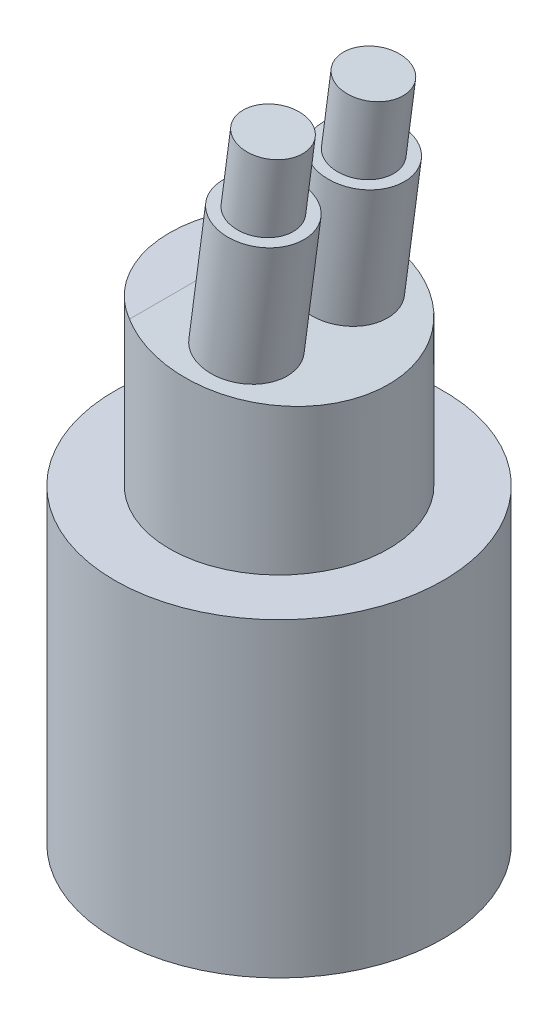
ISO-10303-21;
HEADER;
FILE_DESCRIPTION(('STEP AP214'),'2;1');
FILE_NAME('part.step','',(''),(''),'','','');
FILE_SCHEMA(('AUTOMOTIVE_DESIGN { 1 0 10303 214 1 1 1 1 }'));
ENDSEC;
DATA;
#1=APPLICATION_CONTEXT('core data for automotive mechanical design processes');
#2=APPLICATION_PROTOCOL_DEFINITION('international standard','automotive_design',2000,#1);
#3=PRODUCT_CONTEXT('',#1,'mechanical');
#4=PRODUCT('Part','Part','',(#3));
#5=PRODUCT_RELATED_PRODUCT_CATEGORY('part','',(#4));
#6=PRODUCT_DEFINITION_FORMATION('','',#4);
#7=PRODUCT_DEFINITION_CONTEXT('part definition',#1,'design');
#8=PRODUCT_DEFINITION('design','',#6,#7);
#9=PRODUCT_DEFINITION_SHAPE('','',#8);
#10=(LENGTH_UNIT() NAMED_UNIT(*) SI_UNIT(.MILLI.,.METRE.));
#11=(NAMED_UNIT(*) PLANE_ANGLE_UNIT() SI_UNIT($,.RADIAN.));
#12=(NAMED_UNIT(*) SI_UNIT($,.STERADIAN.) SOLID_ANGLE_UNIT());
#13=UNCERTAINTY_MEASURE_WITH_UNIT(LENGTH_MEASURE(1.E-05),#10,'distance_accuracy_value','');
#14=(GEOMETRIC_REPRESENTATION_CONTEXT(3) GLOBAL_UNCERTAINTY_ASSIGNED_CONTEXT((#13)) GLOBAL_UNIT_ASSIGNED_CONTEXT((#10,
#11,#12)) REPRESENTATION_CONTEXT('',''));
#15=CARTESIAN_POINT('',(0.,0.,0.));
#16=DIRECTION('',(0.,0.,1.));
#17=DIRECTION('',(1.,0.,0.));
#18=AXIS2_PLACEMENT_3D('',#15,#16,#17);
#19=CARTESIAN_POINT('',(2.41871252373174,36.3748520271449,-2.75));
#20=DIRECTION('',(-0.132163720091018,-0.991227900682635,0.));
#21=DIRECTION('',(0.991227900682635,-0.132163720091018,0.));
#22=AXIS2_PLACEMENT_3D('',#19,#20,#21);
#23=CYLINDRICAL_SURFACE('',#22,2.25);
#24=CARTESIAN_POINT('',(0.964911602730543,25.4713451196359,-2.75));
#25=DIRECTION('',(-0.132163720091018,-0.991227900682635,0.));
#26=DIRECTION('',(0.991227900682635,-0.132163720091018,0.));
#27=AXIS2_PLACEMENT_3D('',#24,#25,#26);
#28=CIRCLE('',#27,2.25);
#29=CARTESIAN_POINT('',(3.19517437926647,25.1739767494311,-2.75));
#30=VERTEX_POINT('',#29);
#31=EDGE_CURVE('E41',#30,#30,#28,.F.);
#32=ORIENTED_EDGE('',*,*,#31,.T.);
#33=EDGE_LOOP('',(#32));
#34=FACE_BOUND('',#33,.T.);
#35=CARTESIAN_POINT('',(1.89005764336767,32.4099404244144,-2.75));
#36=DIRECTION('',(0.132163720091018,0.991227900682635,0.));
#37=DIRECTION('',(-0.991227900682635,0.132163720091018,0.));
#38=AXIS2_PLACEMENT_3D('',#35,#36,#37);
#39=CIRCLE('',#38,2.25);
#40=CARTESIAN_POINT('',(-0.340205133168257,32.7073087946192,-2.75));
#41=VERTEX_POINT('',#40);
#42=EDGE_CURVE('E55',#41,#41,#39,.T.);
#43=ORIENTED_EDGE('',*,*,#42,.F.);
#44=EDGE_LOOP('',(#43));
#45=FACE_BOUND('',#44,.T.);
#46=ADVANCED_FACE('F33',(#34,#45),#23,.T.);
#47=CARTESIAN_POINT('',(2.41871252373174,36.3748520271449,2.75));
#48=DIRECTION('',(-0.132163720091018,-0.991227900682635,0.));
#49=DIRECTION('',(0.991227900682635,-0.132163720091018,0.));
#50=AXIS2_PLACEMENT_3D('',#47,#48,#49);
#51=CYLINDRICAL_SURFACE('',#50,2.25);
#52=CARTESIAN_POINT('',(0.964911602730543,25.4713451196359,2.75));
#53=DIRECTION('',(-0.132163720091018,-0.991227900682635,0.));
#54=DIRECTION('',(0.991227900682635,-0.132163720091018,0.));
#55=AXIS2_PLACEMENT_3D('',#52,#53,#54);
#56=CIRCLE('',#55,2.25);
#57=CARTESIAN_POINT('',(3.19517437926647,25.1739767494311,2.75));
#58=VERTEX_POINT('',#57);
#59=EDGE_CURVE('E11',#58,#58,#56,.F.);
#60=ORIENTED_EDGE('',*,*,#59,.T.);
#61=EDGE_LOOP('',(#60));
#62=FACE_BOUND('',#61,.T.);
#63=CARTESIAN_POINT('',(1.89005764336767,32.4099404244144,2.75));
#64=DIRECTION('',(0.132163720091018,0.991227900682635,0.));
#65=DIRECTION('',(-0.991227900682635,0.132163720091018,0.));
#66=AXIS2_PLACEMENT_3D('',#63,#64,#65);
#67=CIRCLE('',#66,2.25);
#68=CARTESIAN_POINT('',(-0.340205133168257,32.7073087946192,2.75));
#69=VERTEX_POINT('',#68);
#70=EDGE_CURVE('E146',#69,#69,#67,.T.);
#71=ORIENTED_EDGE('',*,*,#70,.F.);
#72=EDGE_LOOP('',(#71));
#73=FACE_BOUND('',#72,.T.);
#74=ADVANCED_FACE('F93',(#62,#73),#51,.T.);
#75=CARTESIAN_POINT('',(0.,17.,0.));
#76=DIRECTION('',(0.,-1.,0.));
#77=DIRECTION('',(0.,0.,-1.));
#78=AXIS2_PLACEMENT_3D('',#75,#76,#77);
#79=CYLINDRICAL_SURFACE('',#78,9.);
#80=CARTESIAN_POINT('',(0.,17.,0.));
#81=DIRECTION('',(0.,1.,0.));
#82=DIRECTION('',(0.,0.,1.));
#83=AXIS2_PLACEMENT_3D('',#80,#81,#82);
#84=CIRCLE('',#83,9.);
#85=CARTESIAN_POINT('',(0.,17.,9.));
#86=VERTEX_POINT('',#85);
#87=EDGE_CURVE('E66',#86,#86,#84,.T.);
#88=ORIENTED_EDGE('',*,*,#87,.F.);
#89=EDGE_LOOP('',(#88));
#90=FACE_BOUND('',#89,.T.);
#91=CARTESIAN_POINT('',(0.,0.,0.));
#92=DIRECTION('',(0.,1.,0.));
#93=DIRECTION('',(0.,0.,1.));
#94=AXIS2_PLACEMENT_3D('',#91,#92,#93);
#95=CIRCLE('',#94,9.);
#96=CARTESIAN_POINT('',(0.,0.,9.));
#97=VERTEX_POINT('',#96);
#98=EDGE_CURVE('E63',#97,#97,#95,.T.);
#99=ORIENTED_EDGE('',*,*,#98,.T.);
#100=EDGE_LOOP('',(#99));
#101=FACE_BOUND('',#100,.T.);
#102=ADVANCED_FACE('F35',(#90,#101),#79,.T.);
#103=CARTESIAN_POINT('',(0.,17.,0.));
#104=DIRECTION('',(0.,1.,0.));
#105=DIRECTION('',(0.,0.,1.));
#106=AXIS2_PLACEMENT_3D('',#103,#104,#105);
#107=PLANE('',#106);
#108=CARTESIAN_POINT('',(0.,17.,0.));
#109=DIRECTION('',(0.,1.,0.));
#110=DIRECTION('',(0.,0.,1.));
#111=AXIS2_PLACEMENT_3D('',#108,#109,#110);
#112=CIRCLE('',#111,6.);
#113=CARTESIAN_POINT('',(0.,17.,6.));
#114=VERTEX_POINT('',#113);
#115=EDGE_CURVE('E60',#114,#114,#112,.T.);
#116=ORIENTED_EDGE('',*,*,#115,.F.);
#117=EDGE_LOOP('',(#116));
#118=FACE_BOUND('',#117,.T.);
#119=ORIENTED_EDGE('',*,*,#87,.T.);
#120=EDGE_LOOP('',(#119));
#121=FACE_BOUND('',#120,.T.);
#122=ADVANCED_FACE('F168',(#118,#121),#107,.T.);
#123=CARTESIAN_POINT('',(0.,0.,0.));
#124=DIRECTION('',(0.,1.,0.));
#125=DIRECTION('',(0.,0.,1.));
#126=AXIS2_PLACEMENT_3D('',#123,#124,#125);
#127=PLANE('',#126);
#128=CARTESIAN_POINT('',(0.,0.,0.));
#129=DIRECTION('',(0.,-1.,0.));
#130=DIRECTION('',(0.,0.,-1.));
#131=AXIS2_PLACEMENT_3D('',#128,#129,#130);
#132=CIRCLE('',#131,2.05);
#133=CARTESIAN_POINT('',(0.,0.,-2.05));
#134=VERTEX_POINT('',#133);
#135=EDGE_CURVE('E132',#134,#134,#132,.T.);
#136=ORIENTED_EDGE('',*,*,#135,.F.);
#137=EDGE_LOOP('',(#136));
#138=FACE_BOUND('',#137,.T.);
#139=ORIENTED_EDGE('',*,*,#98,.F.);
#140=EDGE_LOOP('',(#139));
#141=FACE_BOUND('',#140,.T.);
#142=ADVANCED_FACE('F165',(#138,#141),#127,.F.);
#143=CARTESIAN_POINT('',(0.,26.,0.));
#144=DIRECTION('',(0.,-1.,0.));
#145=DIRECTION('',(0.,0.,-1.));
#146=AXIS2_PLACEMENT_3D('',#143,#144,#145);
#147=CYLINDRICAL_SURFACE('',#146,6.);
#148=CARTESIAN_POINT('',(0.,25.6,0.));
#149=DIRECTION('',(-0.132163720091018,-0.991227900682635,0.));
#150=DIRECTION('',(0.991227900682635,-0.132163720091018,0.));
#151=AXIS2_PLACEMENT_3D('',#148,#149,#150);
#152=ELLIPSE('',#151,6.05309838016862,6.);
#153=CARTESIAN_POINT('',(-3.,26.,-5.19615242270664));
#154=VERTEX_POINT('',#153);
#155=CARTESIAN_POINT('',(-3.,26.,5.19615242270663));
#156=VERTEX_POINT('',#155);
#157=EDGE_CURVE('E47',#154,#156,#152,.T.);
#158=ORIENTED_EDGE('',*,*,#157,.T.);
#159=CARTESIAN_POINT('',(0.,26.,0.));
#160=DIRECTION('',(0.,1.,0.));
#161=DIRECTION('',(0.,0.,1.));
#162=AXIS2_PLACEMENT_3D('',#159,#160,#161);
#163=CIRCLE('',#162,6.);
#164=EDGE_CURVE('E54',#154,#156,#163,.T.);
#165=ORIENTED_EDGE('',*,*,#164,.F.);
#166=EDGE_LOOP('',(#158,#165));
#167=FACE_BOUND('',#166,.T.);
#168=ORIENTED_EDGE('',*,*,#115,.T.);
#169=EDGE_LOOP('',(#168));
#170=FACE_BOUND('',#169,.T.);
#171=ADVANCED_FACE('F51',(#167,#170),#147,.T.);
#172=CARTESIAN_POINT('',(0.,26.,0.));
#173=DIRECTION('',(0.,1.,0.));
#174=DIRECTION('',(0.,0.,1.));
#175=AXIS2_PLACEMENT_3D('',#172,#173,#174);
#176=PLANE('',#175);
#177=DIRECTION('',(0.,0.,1.));
#178=VECTOR('',#177,1.);
#179=CARTESIAN_POINT('',(-3.,26.,0.));
#180=LINE('',#179,#178);
#181=EDGE_CURVE('E57',#154,#156,#180,.T.);
#182=ORIENTED_EDGE('',*,*,#181,.F.);
#183=ORIENTED_EDGE('',*,*,#164,.T.);
#184=EDGE_LOOP('',(#182,#183));
#185=FACE_BOUND('',#184,.T.);
#186=ADVANCED_FACE('F62',(#185),#176,.T.);
#187=CARTESIAN_POINT('',(6.,24.8,-8.5));
#188=DIRECTION('',(-0.132163720091018,-0.991227900682635,0.));
#189=DIRECTION('',(0.991227900682635,-0.132163720091018,0.));
#190=AXIS2_PLACEMENT_3D('',#187,#188,#189);
#191=PLANE('',#190);
#192=ORIENTED_EDGE('',*,*,#59,.F.);
#193=EDGE_LOOP('',(#192));
#194=FACE_BOUND('',#193,.T.);
#195=ORIENTED_EDGE('',*,*,#31,.F.);
#196=EDGE_LOOP('',(#195));
#197=FACE_BOUND('',#196,.T.);
#198=ORIENTED_EDGE('',*,*,#157,.F.);
#199=ORIENTED_EDGE('',*,*,#181,.T.);
#200=EDGE_LOOP('',(#198,#199));
#201=FACE_BOUND('',#200,.T.);
#202=ADVANCED_FACE('F58',(#194,#197,#201),#191,.F.);
#203=CARTESIAN_POINT('',(1.89005764336767,32.4099404244144,2.75));
#204=DIRECTION('',(0.132163720091018,0.991227900682635,0.));
#205=DIRECTION('',(-0.991227900682635,0.132163720091018,0.));
#206=AXIS2_PLACEMENT_3D('',#203,#204,#205);
#207=PLANE('',#206);
#208=CARTESIAN_POINT('',(1.89005764336767,32.4099404244144,2.75));
#209=DIRECTION('',(0.132163720091018,0.991227900682635,0.));
#210=DIRECTION('',(-0.991227900682635,0.132163720091018,0.));
#211=AXIS2_PLACEMENT_3D('',#208,#209,#210);
#212=CIRCLE('',#211,1.65);
#213=CARTESIAN_POINT('',(0.254531607241322,32.6280105625645,2.75));
#214=VERTEX_POINT('',#213);
#215=EDGE_CURVE('E135',#214,#214,#212,.T.);
#216=ORIENTED_EDGE('',*,*,#215,.F.);
#217=EDGE_LOOP('',(#216));
#218=FACE_BOUND('',#217,.T.);
#219=ORIENTED_EDGE('',*,*,#70,.T.);
#220=EDGE_LOOP('',(#219));
#221=FACE_BOUND('',#220,.T.);
#222=ADVANCED_FACE('F79',(#218,#221),#207,.T.);
#223=CARTESIAN_POINT('',(1.89005764336767,32.4099404244144,2.75));
#224=DIRECTION('',(0.132163720091018,0.991227900682635,0.));
#225=DIRECTION('',(-0.991227900682635,0.132163720091018,0.));
#226=AXIS2_PLACEMENT_3D('',#223,#224,#225);
#227=CYLINDRICAL_SURFACE('',#226,1.65);
#228=ORIENTED_EDGE('',*,*,#215,.T.);
#229=EDGE_LOOP('',(#228));
#230=FACE_BOUND('',#229,.T.);
#231=CARTESIAN_POINT('',(2.41871252373174,36.3748520271449,2.75));
#232=DIRECTION('',(0.132163720091018,0.991227900682635,0.));
#233=DIRECTION('',(-0.991227900682635,0.132163720091018,0.));
#234=AXIS2_PLACEMENT_3D('',#231,#232,#233);
#235=CIRCLE('',#234,1.65);
#236=CARTESIAN_POINT('',(0.783186487605394,36.5929221652951,2.75));
#237=VERTEX_POINT('',#236);
#238=EDGE_CURVE('E131',#237,#237,#235,.T.);
#239=ORIENTED_EDGE('',*,*,#238,.F.);
#240=EDGE_LOOP('',(#239));
#241=FACE_BOUND('',#240,.T.);
#242=ADVANCED_FACE('F86',(#230,#241),#227,.T.);
#243=CARTESIAN_POINT('',(1.89005764336767,32.4099404244144,-2.75));
#244=DIRECTION('',(0.132163720091018,0.991227900682635,0.));
#245=DIRECTION('',(-0.991227900682635,0.132163720091018,0.));
#246=AXIS2_PLACEMENT_3D('',#243,#244,#245);
#247=PLANE('',#246);
#248=CARTESIAN_POINT('',(1.89005764336767,32.4099404244144,-2.75));
#249=DIRECTION('',(0.132163720091018,0.991227900682635,0.));
#250=DIRECTION('',(-0.991227900682635,0.132163720091018,0.));
#251=AXIS2_PLACEMENT_3D('',#248,#249,#250);
#252=CIRCLE('',#251,1.65);
#253=CARTESIAN_POINT('',(0.254531607241322,32.6280105625645,-2.75));
#254=VERTEX_POINT('',#253);
#255=EDGE_CURVE('E140',#254,#254,#252,.T.);
#256=ORIENTED_EDGE('',*,*,#255,.F.);
#257=EDGE_LOOP('',(#256));
#258=FACE_BOUND('',#257,.T.);
#259=ORIENTED_EDGE('',*,*,#42,.T.);
#260=EDGE_LOOP('',(#259));
#261=FACE_BOUND('',#260,.T.);
#262=ADVANCED_FACE('F112',(#258,#261),#247,.T.);
#263=CARTESIAN_POINT('',(1.89005764336767,32.4099404244144,-2.75));
#264=DIRECTION('',(0.132163720091018,0.991227900682635,0.));
#265=DIRECTION('',(-0.991227900682635,0.132163720091018,0.));
#266=AXIS2_PLACEMENT_3D('',#263,#264,#265);
#267=CYLINDRICAL_SURFACE('',#266,1.65);
#268=ORIENTED_EDGE('',*,*,#255,.T.);
#269=EDGE_LOOP('',(#268));
#270=FACE_BOUND('',#269,.T.);
#271=CARTESIAN_POINT('',(2.41871252373174,36.3748520271449,-2.75));
#272=DIRECTION('',(0.132163720091018,0.991227900682635,0.));
#273=DIRECTION('',(-0.991227900682635,0.132163720091018,0.));
#274=AXIS2_PLACEMENT_3D('',#271,#272,#273);
#275=CIRCLE('',#274,1.65);
#276=CARTESIAN_POINT('',(0.783186487605394,36.5929221652951,-2.75));
#277=VERTEX_POINT('',#276);
#278=EDGE_CURVE('E143',#277,#277,#275,.T.);
#279=ORIENTED_EDGE('',*,*,#278,.F.);
#280=EDGE_LOOP('',(#279));
#281=FACE_BOUND('',#280,.T.);
#282=ADVANCED_FACE('F107',(#270,#281),#267,.T.);
#283=CARTESIAN_POINT('',(2.41871252373174,36.3748520271449,2.75));
#284=DIRECTION('',(0.132163720091018,0.991227900682635,0.));
#285=DIRECTION('',(-0.991227900682635,0.132163720091018,0.));
#286=AXIS2_PLACEMENT_3D('',#283,#284,#285);
#287=PLANE('',#286);
#288=ORIENTED_EDGE('',*,*,#238,.T.);
#289=EDGE_LOOP('',(#288));
#290=FACE_BOUND('',#289,.T.);
#291=ADVANCED_FACE('F103',(#290),#287,.T.);
#292=CARTESIAN_POINT('',(2.41871252373174,36.3748520271449,-2.75));
#293=DIRECTION('',(0.132163720091018,0.991227900682635,0.));
#294=DIRECTION('',(-0.991227900682635,0.132163720091018,0.));
#295=AXIS2_PLACEMENT_3D('',#292,#293,#294);
#296=PLANE('',#295);
#297=ORIENTED_EDGE('',*,*,#278,.T.);
#298=EDGE_LOOP('',(#297));
#299=FACE_BOUND('',#298,.T.);
#300=ADVANCED_FACE('F100',(#299),#296,.T.);
#301=CARTESIAN_POINT('',(0.,5.,0.));
#302=DIRECTION('',(0.,-1.,0.));
#303=DIRECTION('',(0.,0.,-1.));
#304=AXIS2_PLACEMENT_3D('',#301,#302,#303);
#305=CYLINDRICAL_SURFACE('',#304,2.05);
#306=CARTESIAN_POINT('',(0.,5.,0.));
#307=DIRECTION('',(0.,-1.,0.));
#308=DIRECTION('',(0.,0.,-1.));
#309=AXIS2_PLACEMENT_3D('',#306,#307,#308);
#310=CIRCLE('',#309,2.05);
#311=CARTESIAN_POINT('',(0.,5.,-2.05));
#312=VERTEX_POINT('',#311);
#313=EDGE_CURVE('E130',#312,#312,#310,.T.);
#314=ORIENTED_EDGE('',*,*,#313,.F.);
#315=EDGE_LOOP('',(#314));
#316=FACE_BOUND('',#315,.T.);
#317=ORIENTED_EDGE('',*,*,#135,.T.);
#318=EDGE_LOOP('',(#317));
#319=FACE_BOUND('',#318,.T.);
#320=ADVANCED_FACE('F102',(#316,#319),#305,.F.);
#321=CARTESIAN_POINT('',(0.,5.,0.));
#322=DIRECTION('',(0.,-1.,0.));
#323=DIRECTION('',(0.,0.,-1.));
#324=AXIS2_PLACEMENT_3D('',#321,#322,#323);
#325=PLANE('',#324);
#326=ORIENTED_EDGE('',*,*,#313,.T.);
#327=EDGE_LOOP('',(#326));
#328=FACE_BOUND('',#327,.T.);
#329=ADVANCED_FACE('F122',(#328),#325,.T.);
#330=CLOSED_SHELL('',(#46,#74,#102,#122,#142,#171,#186,#202,#222,#242,#262,#282,#291,#300,#320,#329));
#331=MANIFOLD_SOLID_BREP('B2',#330);
#332=ADVANCED_BREP_SHAPE_REPRESENTATION('',(#18,#331),#14);
#333=SHAPE_DEFINITION_REPRESENTATION(#9,#332);
ENDSEC;
END-ISO-10303-21;
